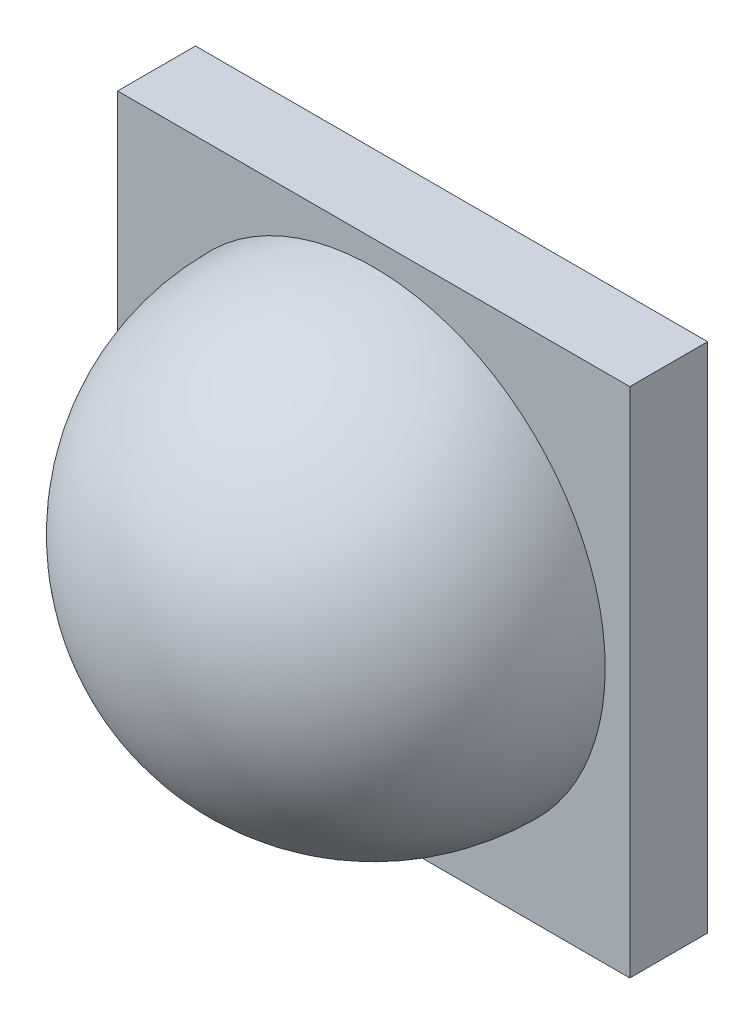
ISO-10303-21;
HEADER;
FILE_DESCRIPTION(('STEP AP214'),'2;1');
FILE_NAME('part.step','',(''),(''),'','','');
FILE_SCHEMA(('AUTOMOTIVE_DESIGN { 1 0 10303 214 1 1 1 1 }'));
ENDSEC;
DATA;
#1=APPLICATION_CONTEXT('core data for automotive mechanical design processes');
#2=APPLICATION_PROTOCOL_DEFINITION('international standard','automotive_design',2000,#1);
#3=PRODUCT_CONTEXT('',#1,'mechanical');
#4=PRODUCT('Part','Part','',(#3));
#5=PRODUCT_RELATED_PRODUCT_CATEGORY('part','',(#4));
#6=PRODUCT_DEFINITION_FORMATION('','',#4);
#7=PRODUCT_DEFINITION_CONTEXT('part definition',#1,'design');
#8=PRODUCT_DEFINITION('design','',#6,#7);
#9=PRODUCT_DEFINITION_SHAPE('','',#8);
#10=(LENGTH_UNIT() NAMED_UNIT(*) SI_UNIT(.MILLI.,.METRE.));
#11=(NAMED_UNIT(*) PLANE_ANGLE_UNIT() SI_UNIT($,.RADIAN.));
#12=(NAMED_UNIT(*) SI_UNIT($,.STERADIAN.) SOLID_ANGLE_UNIT());
#13=UNCERTAINTY_MEASURE_WITH_UNIT(LENGTH_MEASURE(1.E-05),#10,'distance_accuracy_value','');
#14=(GEOMETRIC_REPRESENTATION_CONTEXT(3) GLOBAL_UNCERTAINTY_ASSIGNED_CONTEXT((#13)) GLOBAL_UNIT_ASSIGNED_CONTEXT((#10,
#11,#12)) REPRESENTATION_CONTEXT('',''));
#15=CARTESIAN_POINT('',(0.,0.,0.));
#16=DIRECTION('',(0.,0.,1.));
#17=DIRECTION('',(1.,0.,0.));
#18=AXIS2_PLACEMENT_3D('',#15,#16,#17);
#19=CARTESIAN_POINT('',(2.5,2.5,0.76));
#20=DIRECTION('',(-1.,0.,0.));
#21=DIRECTION('',(0.,-1.,0.));
#22=AXIS2_PLACEMENT_3D('',#19,#20,#21);
#23=PLANE('',#22);
#24=DIRECTION('',(0.,1.,0.));
#25=VECTOR('',#24,1.);
#26=CARTESIAN_POINT('',(2.5,2.5,0.));
#27=LINE('',#26,#25);
#28=CARTESIAN_POINT('',(2.5,-2.5,0.));
#29=VERTEX_POINT('',#28);
#30=CARTESIAN_POINT('',(2.5,2.5,0.));
#31=VERTEX_POINT('',#30);
#32=EDGE_CURVE('E96',#29,#31,#27,.T.);
#33=ORIENTED_EDGE('',*,*,#32,.T.);
#34=DIRECTION('',(0.,0.,-1.));
#35=VECTOR('',#34,1.);
#36=CARTESIAN_POINT('',(2.5,2.5,0.76));
#37=LINE('',#36,#35);
#38=CARTESIAN_POINT('',(2.5,2.5,0.76));
#39=VERTEX_POINT('',#38);
#40=EDGE_CURVE('E11',#39,#31,#37,.T.);
#41=ORIENTED_EDGE('',*,*,#40,.F.);
#42=DIRECTION('',(0.,1.,0.));
#43=VECTOR('',#42,1.);
#44=CARTESIAN_POINT('',(2.5,2.5,0.76));
#45=LINE('',#44,#43);
#46=CARTESIAN_POINT('',(2.5,-2.5,0.76));
#47=VERTEX_POINT('',#46);
#48=EDGE_CURVE('E84',#47,#39,#45,.T.);
#49=ORIENTED_EDGE('',*,*,#48,.F.);
#50=DIRECTION('',(0.,0.,-1.));
#51=VECTOR('',#50,1.);
#52=CARTESIAN_POINT('',(2.5,-2.5,0.76));
#53=LINE('',#52,#51);
#54=EDGE_CURVE('E92',#47,#29,#53,.T.);
#55=ORIENTED_EDGE('',*,*,#54,.T.);
#56=EDGE_LOOP('',(#33,#41,#49,#55));
#57=FACE_BOUND('',#56,.T.);
#58=ADVANCED_FACE('F33',(#57),#23,.F.);
#59=CARTESIAN_POINT('',(-2.5,2.5,0.76));
#60=DIRECTION('',(0.,-1.,0.));
#61=DIRECTION('',(0.,0.,-1.));
#62=AXIS2_PLACEMENT_3D('',#59,#60,#61);
#63=PLANE('',#62);
#64=DIRECTION('',(-1.,0.,0.));
#65=VECTOR('',#64,1.);
#66=CARTESIAN_POINT('',(-2.5,2.5,0.));
#67=LINE('',#66,#65);
#68=CARTESIAN_POINT('',(-2.5,2.5,0.));
#69=VERTEX_POINT('',#68);
#70=EDGE_CURVE('E88',#31,#69,#67,.T.);
#71=ORIENTED_EDGE('',*,*,#70,.T.);
#72=DIRECTION('',(0.,0.,-1.));
#73=VECTOR('',#72,1.);
#74=CARTESIAN_POINT('',(-2.5,2.5,0.76));
#75=LINE('',#74,#73);
#76=CARTESIAN_POINT('',(-2.5,2.5,0.76));
#77=VERTEX_POINT('',#76);
#78=EDGE_CURVE('E41',#77,#69,#75,.T.);
#79=ORIENTED_EDGE('',*,*,#78,.F.);
#80=DIRECTION('',(-1.,0.,0.));
#81=VECTOR('',#80,1.);
#82=CARTESIAN_POINT('',(-2.5,2.5,0.76));
#83=LINE('',#82,#81);
#84=EDGE_CURVE('E79',#39,#77,#83,.T.);
#85=ORIENTED_EDGE('',*,*,#84,.F.);
#86=ORIENTED_EDGE('',*,*,#40,.T.);
#87=EDGE_LOOP('',(#71,#79,#85,#86));
#88=FACE_BOUND('',#87,.T.);
#89=ADVANCED_FACE('F87',(#88),#63,.F.);
#90=CARTESIAN_POINT('',(-2.5,2.5,0.76));
#91=DIRECTION('',(1.,0.,0.));
#92=DIRECTION('',(0.,1.,0.));
#93=AXIS2_PLACEMENT_3D('',#90,#91,#92);
#94=PLANE('',#93);
#95=DIRECTION('',(0.,-1.,0.));
#96=VECTOR('',#95,1.);
#97=CARTESIAN_POINT('',(-2.5,2.5,0.));
#98=LINE('',#97,#96);
#99=CARTESIAN_POINT('',(-2.5,-2.5,0.));
#100=VERTEX_POINT('',#99);
#101=EDGE_CURVE('E66',#69,#100,#98,.T.);
#102=ORIENTED_EDGE('',*,*,#101,.T.);
#103=DIRECTION('',(0.,0.,-1.));
#104=VECTOR('',#103,1.);
#105=CARTESIAN_POINT('',(-2.5,-2.5,0.76));
#106=LINE('',#105,#104);
#107=CARTESIAN_POINT('',(-2.5,-2.5,0.76));
#108=VERTEX_POINT('',#107);
#109=EDGE_CURVE('E89',#108,#100,#106,.T.);
#110=ORIENTED_EDGE('',*,*,#109,.F.);
#111=DIRECTION('',(0.,-1.,0.));
#112=VECTOR('',#111,1.);
#113=CARTESIAN_POINT('',(-2.5,2.5,0.76));
#114=LINE('',#113,#112);
#115=EDGE_CURVE('E82',#77,#108,#114,.T.);
#116=ORIENTED_EDGE('',*,*,#115,.F.);
#117=ORIENTED_EDGE('',*,*,#78,.T.);
#118=EDGE_LOOP('',(#102,#110,#116,#117));
#119=FACE_BOUND('',#118,.T.);
#120=ADVANCED_FACE('F90',(#119),#94,.F.);
#121=CARTESIAN_POINT('',(-2.5,-2.5,0.76));
#122=DIRECTION('',(0.,1.,0.));
#123=DIRECTION('',(0.,0.,1.));
#124=AXIS2_PLACEMENT_3D('',#121,#122,#123);
#125=PLANE('',#124);
#126=DIRECTION('',(1.,0.,0.));
#127=VECTOR('',#126,1.);
#128=CARTESIAN_POINT('',(-2.5,-2.5,0.));
#129=LINE('',#128,#127);
#130=EDGE_CURVE('E72',#100,#29,#129,.T.);
#131=ORIENTED_EDGE('',*,*,#130,.T.);
#132=ORIENTED_EDGE('',*,*,#54,.F.);
#133=DIRECTION('',(1.,0.,0.));
#134=VECTOR('',#133,1.);
#135=CARTESIAN_POINT('',(-2.5,-2.5,0.76));
#136=LINE('',#135,#134);
#137=EDGE_CURVE('E49',#108,#47,#136,.T.);
#138=ORIENTED_EDGE('',*,*,#137,.F.);
#139=ORIENTED_EDGE('',*,*,#109,.T.);
#140=EDGE_LOOP('',(#131,#132,#138,#139));
#141=FACE_BOUND('',#140,.T.);
#142=ADVANCED_FACE('F104',(#141),#125,.F.);
#143=CARTESIAN_POINT('',(0.,0.,0.76));
#144=DIRECTION('',(0.,0.,1.));
#145=DIRECTION('',(1.,0.,0.));
#146=AXIS2_PLACEMENT_3D('',#143,#144,#145);
#147=PLANE('',#146);
#148=CARTESIAN_POINT('',(0.,0.,0.76));
#149=DIRECTION('',(0.,0.,-1.));
#150=DIRECTION('',(-1.,0.,0.));
#151=AXIS2_PLACEMENT_3D('',#148,#149,#150);
#152=CIRCLE('',#151,2.26);
#153=CARTESIAN_POINT('',(-2.26,0.,0.76));
#154=VERTEX_POINT('',#153);
#155=EDGE_CURVE('E99',#154,#154,#152,.T.);
#156=ORIENTED_EDGE('',*,*,#155,.T.);
#157=EDGE_LOOP('',(#156));
#158=FACE_BOUND('',#157,.T.);
#159=ORIENTED_EDGE('',*,*,#48,.T.);
#160=ORIENTED_EDGE('',*,*,#84,.T.);
#161=ORIENTED_EDGE('',*,*,#115,.T.);
#162=ORIENTED_EDGE('',*,*,#137,.T.);
#163=EDGE_LOOP('',(#159,#160,#161,#162));
#164=FACE_BOUND('',#163,.T.);
#165=ADVANCED_FACE('F80',(#158,#164),#147,.T.);
#166=CARTESIAN_POINT('',(0.,0.,0.));
#167=DIRECTION('',(0.,0.,1.));
#168=DIRECTION('',(1.,0.,0.));
#169=AXIS2_PLACEMENT_3D('',#166,#167,#168);
#170=PLANE('',#169);
#171=ORIENTED_EDGE('',*,*,#32,.F.);
#172=ORIENTED_EDGE('',*,*,#130,.F.);
#173=ORIENTED_EDGE('',*,*,#101,.F.);
#174=ORIENTED_EDGE('',*,*,#70,.F.);
#175=EDGE_LOOP('',(#171,#172,#173,#174));
#176=FACE_BOUND('',#175,.T.);
#177=ADVANCED_FACE('F107',(#176),#170,.F.);
#178=CARTESIAN_POINT('',(0.,0.,0.76));
#179=DIRECTION('',(0.,0.,-1.));
#180=DIRECTION('',(1.,0.,0.));
#181=AXIS2_PLACEMENT_3D('',#178,#179,#180);
#182=SPHERICAL_SURFACE('',#181,2.26);
#183=ORIENTED_EDGE('',*,*,#155,.F.);
#184=EDGE_LOOP('',(#183));
#185=FACE_BOUND('',#184,.T.);
#186=ADVANCED_FACE('F114',(#185),#182,.T.);
#187=CLOSED_SHELL('',(#58,#89,#120,#142,#165,#177,#186));
#188=MANIFOLD_SOLID_BREP('B2',#187);
#189=ADVANCED_BREP_SHAPE_REPRESENTATION('',(#18,#188),#14);
#190=SHAPE_DEFINITION_REPRESENTATION(#9,#189);
ENDSEC;
END-ISO-10303-21;
